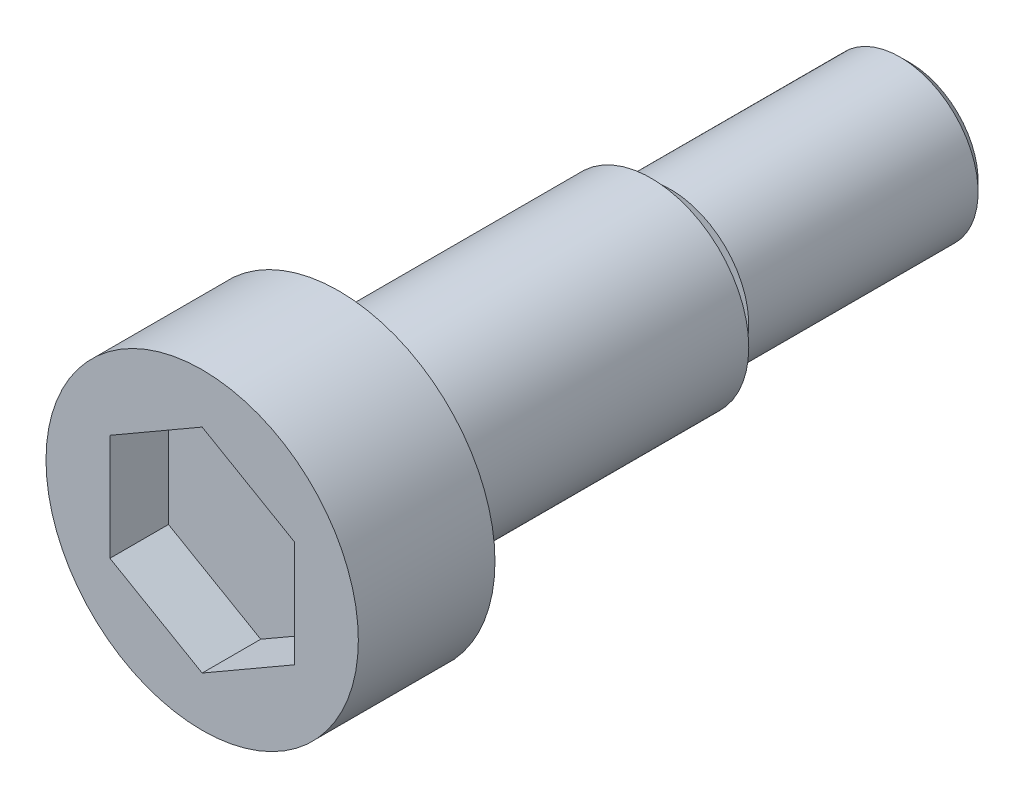
ISO-10303-21;
HEADER;
FILE_DESCRIPTION(('STEP AP214'),'2;1');
FILE_NAME('part.step','',(''),(''),'','','');
FILE_SCHEMA(('AUTOMOTIVE_DESIGN { 1 0 10303 214 1 1 1 1 }'));
ENDSEC;
DATA;
#1=APPLICATION_CONTEXT('core data for automotive mechanical design processes');
#2=APPLICATION_PROTOCOL_DEFINITION('international standard','automotive_design',2000,#1);
#3=PRODUCT_CONTEXT('',#1,'mechanical');
#4=PRODUCT('Part','Part','',(#3));
#5=PRODUCT_RELATED_PRODUCT_CATEGORY('part','',(#4));
#6=PRODUCT_DEFINITION_FORMATION('','',#4);
#7=PRODUCT_DEFINITION_CONTEXT('part definition',#1,'design');
#8=PRODUCT_DEFINITION('design','',#6,#7);
#9=PRODUCT_DEFINITION_SHAPE('','',#8);
#10=(LENGTH_UNIT() NAMED_UNIT(*) SI_UNIT(.MILLI.,.METRE.));
#11=(NAMED_UNIT(*) PLANE_ANGLE_UNIT() SI_UNIT($,.RADIAN.));
#12=(NAMED_UNIT(*) SI_UNIT($,.STERADIAN.) SOLID_ANGLE_UNIT());
#13=UNCERTAINTY_MEASURE_WITH_UNIT(LENGTH_MEASURE(1.E-05),#10,'distance_accuracy_value','');
#14=(GEOMETRIC_REPRESENTATION_CONTEXT(3) GLOBAL_UNCERTAINTY_ASSIGNED_CONTEXT((#13)) GLOBAL_UNIT_ASSIGNED_CONTEXT((#10,
#11,#12)) REPRESENTATION_CONTEXT('',''));
#15=CARTESIAN_POINT('',(0.,0.,0.));
#16=DIRECTION('',(0.,0.,1.));
#17=DIRECTION('',(1.,0.,0.));
#18=AXIS2_PLACEMENT_3D('',#15,#16,#17);
#19=CARTESIAN_POINT('',(0.,0.,16.));
#20=DIRECTION('',(0.,0.,-1.));
#21=DIRECTION('',(-1.,0.,0.));
#22=AXIS2_PLACEMENT_3D('',#19,#20,#21);
#23=CYLINDRICAL_SURFACE('',#22,5.);
#24=CARTESIAN_POINT('',(0.,0.,16.));
#25=DIRECTION('',(0.,0.,1.));
#26=DIRECTION('',(1.,0.,0.));
#27=AXIS2_PLACEMENT_3D('',#24,#25,#26);
#28=CIRCLE('',#27,5.);
#29=CARTESIAN_POINT('',(5.,0.,16.));
#30=VERTEX_POINT('',#29);
#31=EDGE_CURVE('E178',#30,#30,#28,.T.);
#32=ORIENTED_EDGE('',*,*,#31,.F.);
#33=EDGE_LOOP('',(#32));
#34=FACE_BOUND('',#33,.T.);
#35=CARTESIAN_POINT('',(0.,0.,0.));
#36=DIRECTION('',(0.,0.,1.));
#37=DIRECTION('',(1.,0.,0.));
#38=AXIS2_PLACEMENT_3D('',#35,#36,#37);
#39=CIRCLE('',#38,5.);
#40=CARTESIAN_POINT('',(5.,0.,0.));
#41=VERTEX_POINT('',#40);
#42=EDGE_CURVE('E174',#41,#41,#39,.T.);
#43=ORIENTED_EDGE('',*,*,#42,.T.);
#44=EDGE_LOOP('',(#43));
#45=FACE_BOUND('',#44,.T.);
#46=ADVANCED_FACE('F44',(#34,#45),#23,.T.);
#47=CARTESIAN_POINT('',(0.,0.,0.));
#48=DIRECTION('',(0.,0.,1.));
#49=DIRECTION('',(1.,0.,0.));
#50=AXIS2_PLACEMENT_3D('',#47,#48,#49);
#51=PLANE('',#50);
#52=ORIENTED_EDGE('',*,*,#42,.F.);
#53=EDGE_LOOP('',(#52));
#54=FACE_BOUND('',#53,.T.);
#55=CARTESIAN_POINT('',(0.,0.,0.));
#56=DIRECTION('',(0.,0.,-1.));
#57=DIRECTION('',(-1.,0.,0.));
#58=AXIS2_PLACEMENT_3D('',#55,#56,#57);
#59=CIRCLE('',#58,3.5);
#60=CARTESIAN_POINT('',(-3.5,0.,0.));
#61=VERTEX_POINT('',#60);
#62=EDGE_CURVE('E259',#61,#61,#59,.T.);
#63=ORIENTED_EDGE('',*,*,#62,.F.);
#64=EDGE_LOOP('',(#63));
#65=FACE_BOUND('',#64,.T.);
#66=ADVANCED_FACE('F203',(#54,#65),#51,.F.);
#67=CARTESIAN_POINT('',(0.,0.,23.));
#68=DIRECTION('',(0.,0.,-1.));
#69=DIRECTION('',(-1.,0.,0.));
#70=AXIS2_PLACEMENT_3D('',#67,#68,#69);
#71=CYLINDRICAL_SURFACE('',#70,8.);
#72=CARTESIAN_POINT('',(0.,0.,23.));
#73=DIRECTION('',(0.,0.,1.));
#74=DIRECTION('',(1.,0.,0.));
#75=AXIS2_PLACEMENT_3D('',#72,#73,#74);
#76=CIRCLE('',#75,8.);
#77=CARTESIAN_POINT('',(8.,0.,23.));
#78=VERTEX_POINT('',#77);
#79=EDGE_CURVE('E170',#78,#78,#76,.T.);
#80=ORIENTED_EDGE('',*,*,#79,.F.);
#81=EDGE_LOOP('',(#80));
#82=FACE_BOUND('',#81,.T.);
#83=CARTESIAN_POINT('',(0.,0.,16.));
#84=DIRECTION('',(0.,0.,1.));
#85=DIRECTION('',(1.,0.,0.));
#86=AXIS2_PLACEMENT_3D('',#83,#84,#85);
#87=CIRCLE('',#86,8.);
#88=CARTESIAN_POINT('',(8.,0.,16.));
#89=VERTEX_POINT('',#88);
#90=EDGE_CURVE('E160',#89,#89,#87,.T.);
#91=ORIENTED_EDGE('',*,*,#90,.T.);
#92=EDGE_LOOP('',(#91));
#93=FACE_BOUND('',#92,.T.);
#94=ADVANCED_FACE('F208',(#82,#93),#71,.T.);
#95=CARTESIAN_POINT('',(0.,0.,23.));
#96=DIRECTION('',(0.,0.,1.));
#97=DIRECTION('',(1.,0.,0.));
#98=AXIS2_PLACEMENT_3D('',#95,#96,#97);
#99=PLANE('',#98);
#100=DIRECTION('',(-0.866025403784442,0.499999999999995,0.));
#101=VECTOR('',#100,1.);
#102=CARTESIAN_POINT('',(4.72523829047929,2.72811759899342,23.));
#103=LINE('',#102,#101);
#104=CARTESIAN_POINT('',(4.72523829047929,2.72811759899342,23.));
#105=VERTEX_POINT('',#104);
#106=CARTESIAN_POINT('',(0.,5.45623519798673,23.));
#107=VERTEX_POINT('',#106);
#108=EDGE_CURVE('E60',#105,#107,#103,.T.);
#109=ORIENTED_EDGE('',*,*,#108,.F.);
#110=DIRECTION('',(0.,1.,0.));
#111=VECTOR('',#110,1.);
#112=CARTESIAN_POINT('',(4.72523829047935,-2.72811759899332,23.));
#113=LINE('',#112,#111);
#114=CARTESIAN_POINT('',(4.72523829047935,-2.72811759899332,23.));
#115=VERTEX_POINT('',#114);
#116=EDGE_CURVE('E154',#115,#105,#113,.T.);
#117=ORIENTED_EDGE('',*,*,#116,.F.);
#118=DIRECTION('',(0.866025403784435,0.500000000000007,0.));
#119=VECTOR('',#118,1.);
#120=CARTESIAN_POINT('',(0.,-5.45623519798673,23.));
#121=LINE('',#120,#119);
#122=CARTESIAN_POINT('',(0.,-5.45623519798673,23.));
#123=VERTEX_POINT('',#122);
#124=EDGE_CURVE('E151',#123,#115,#121,.T.);
#125=ORIENTED_EDGE('',*,*,#124,.F.);
#126=DIRECTION('',(0.866025403784442,-0.499999999999995,0.));
#127=VECTOR('',#126,1.);
#128=CARTESIAN_POINT('',(-4.72523829047931,-2.72811759899339,23.));
#129=LINE('',#128,#127);
#130=CARTESIAN_POINT('',(-4.72523829047931,-2.72811759899339,23.));
#131=VERTEX_POINT('',#130);
#132=EDGE_CURVE('E108',#131,#123,#129,.T.);
#133=ORIENTED_EDGE('',*,*,#132,.F.);
#134=DIRECTION('',(0.,-1.,0.));
#135=VECTOR('',#134,1.);
#136=CARTESIAN_POINT('',(-4.72523829047933,2.72811759899335,23.));
#137=LINE('',#136,#135);
#138=CARTESIAN_POINT('',(-4.72523829047933,2.72811759899335,23.));
#139=VERTEX_POINT('',#138);
#140=EDGE_CURVE('E146',#139,#131,#137,.T.);
#141=ORIENTED_EDGE('',*,*,#140,.F.);
#142=DIRECTION('',(-0.866025403784438,-0.500000000000001,0.));
#143=VECTOR('',#142,1.);
#144=CARTESIAN_POINT('',(0.,5.45623519798673,23.));
#145=LINE('',#144,#143);
#146=EDGE_CURVE('E142',#107,#139,#145,.T.);
#147=ORIENTED_EDGE('',*,*,#146,.F.);
#148=EDGE_LOOP('',(#109,#117,#125,#133,#141,#147));
#149=FACE_BOUND('',#148,.T.);
#150=ORIENTED_EDGE('',*,*,#79,.T.);
#151=EDGE_LOOP('',(#150));
#152=FACE_BOUND('',#151,.T.);
#153=ADVANCED_FACE('F216',(#149,#152),#99,.T.);
#154=CARTESIAN_POINT('',(0.,0.,16.));
#155=DIRECTION('',(0.,0.,1.));
#156=DIRECTION('',(1.,0.,0.));
#157=AXIS2_PLACEMENT_3D('',#154,#155,#156);
#158=PLANE('',#157);
#159=ORIENTED_EDGE('',*,*,#31,.T.);
#160=EDGE_LOOP('',(#159));
#161=FACE_BOUND('',#160,.T.);
#162=ORIENTED_EDGE('',*,*,#90,.F.);
#163=EDGE_LOOP('',(#162));
#164=FACE_BOUND('',#163,.T.);
#165=ADVANCED_FACE('F218',(#161,#164),#158,.F.);
#166=CARTESIAN_POINT('',(4.72523829047929,2.72811759899342,20.));
#167=DIRECTION('',(0.499999999999995,0.866025403784441,0.));
#168=DIRECTION('',(-0.866025403784442,0.499999999999995,0.));
#169=AXIS2_PLACEMENT_3D('',#166,#167,#168);
#170=PLANE('',#169);
#171=ORIENTED_EDGE('',*,*,#108,.T.);
#172=DIRECTION('',(0.,0.,1.));
#173=VECTOR('',#172,1.);
#174=CARTESIAN_POINT('',(0.,5.45623519798673,20.));
#175=LINE('',#174,#173);
#176=CARTESIAN_POINT('',(0.,5.45623519798673,20.));
#177=VERTEX_POINT('',#176);
#178=EDGE_CURVE('E90',#177,#107,#175,.T.);
#179=ORIENTED_EDGE('',*,*,#178,.F.);
#180=DIRECTION('',(-0.866025403784442,0.499999999999995,0.));
#181=VECTOR('',#180,1.);
#182=CARTESIAN_POINT('',(4.72523829047929,2.72811759899342,20.));
#183=LINE('',#182,#181);
#184=CARTESIAN_POINT('',(4.72523829047929,2.72811759899342,20.));
#185=VERTEX_POINT('',#184);
#186=EDGE_CURVE('E157',#185,#177,#183,.T.);
#187=ORIENTED_EDGE('',*,*,#186,.F.);
#188=DIRECTION('',(0.,0.,1.));
#189=VECTOR('',#188,1.);
#190=CARTESIAN_POINT('',(4.72523829047929,2.72811759899342,20.));
#191=LINE('',#190,#189);
#192=EDGE_CURVE('E68',#185,#105,#191,.T.);
#193=ORIENTED_EDGE('',*,*,#192,.T.);
#194=EDGE_LOOP('',(#171,#179,#187,#193));
#195=FACE_BOUND('',#194,.T.);
#196=ADVANCED_FACE('F221',(#195),#170,.F.);
#197=CARTESIAN_POINT('',(4.72523829047935,-2.72811759899332,20.));
#198=DIRECTION('',(1.,0.,0.));
#199=DIRECTION('',(0.,1.,0.));
#200=AXIS2_PLACEMENT_3D('',#197,#198,#199);
#201=PLANE('',#200);
#202=ORIENTED_EDGE('',*,*,#116,.T.);
#203=ORIENTED_EDGE('',*,*,#192,.F.);
#204=DIRECTION('',(0.,1.,0.));
#205=VECTOR('',#204,1.);
#206=CARTESIAN_POINT('',(4.72523829047935,-2.72811759899332,20.));
#207=LINE('',#206,#205);
#208=CARTESIAN_POINT('',(4.72523829047935,-2.72811759899332,20.));
#209=VERTEX_POINT('',#208);
#210=EDGE_CURVE('E122',#209,#185,#207,.T.);
#211=ORIENTED_EDGE('',*,*,#210,.F.);
#212=DIRECTION('',(0.,0.,1.));
#213=VECTOR('',#212,1.);
#214=CARTESIAN_POINT('',(4.72523829047935,-2.72811759899332,20.));
#215=LINE('',#214,#213);
#216=EDGE_CURVE('E113',#209,#115,#215,.T.);
#217=ORIENTED_EDGE('',*,*,#216,.T.);
#218=EDGE_LOOP('',(#202,#203,#211,#217));
#219=FACE_BOUND('',#218,.T.);
#220=ADVANCED_FACE('F228',(#219),#201,.F.);
#221=CARTESIAN_POINT('',(0.,-5.45623519798673,20.));
#222=DIRECTION('',(0.500000000000007,-0.866025403784434,0.));
#223=DIRECTION('',(0.866025403784435,0.500000000000007,0.));
#224=AXIS2_PLACEMENT_3D('',#221,#222,#223);
#225=PLANE('',#224);
#226=ORIENTED_EDGE('',*,*,#124,.T.);
#227=ORIENTED_EDGE('',*,*,#216,.F.);
#228=DIRECTION('',(0.866025403784435,0.500000000000007,0.));
#229=VECTOR('',#228,1.);
#230=CARTESIAN_POINT('',(0.,-5.45623519798673,20.));
#231=LINE('',#230,#229);
#232=CARTESIAN_POINT('',(0.,-5.45623519798673,20.));
#233=VERTEX_POINT('',#232);
#234=EDGE_CURVE('E117',#233,#209,#231,.T.);
#235=ORIENTED_EDGE('',*,*,#234,.F.);
#236=DIRECTION('',(0.,0.,1.));
#237=VECTOR('',#236,1.);
#238=CARTESIAN_POINT('',(0.,-5.45623519798673,20.));
#239=LINE('',#238,#237);
#240=EDGE_CURVE('E101',#233,#123,#239,.T.);
#241=ORIENTED_EDGE('',*,*,#240,.T.);
#242=EDGE_LOOP('',(#226,#227,#235,#241));
#243=FACE_BOUND('',#242,.T.);
#244=ADVANCED_FACE('F118',(#243),#225,.F.);
#245=CARTESIAN_POINT('',(-4.72523829047931,-2.72811759899339,20.));
#246=DIRECTION('',(-0.499999999999995,-0.866025403784441,0.));
#247=DIRECTION('',(0.866025403784442,-0.499999999999995,0.));
#248=AXIS2_PLACEMENT_3D('',#245,#246,#247);
#249=PLANE('',#248);
#250=ORIENTED_EDGE('',*,*,#132,.T.);
#251=ORIENTED_EDGE('',*,*,#240,.F.);
#252=DIRECTION('',(0.866025403784442,-0.499999999999995,0.));
#253=VECTOR('',#252,1.);
#254=CARTESIAN_POINT('',(-4.72523829047931,-2.72811759899339,20.));
#255=LINE('',#254,#253);
#256=CARTESIAN_POINT('',(-4.72523829047931,-2.72811759899339,20.));
#257=VERTEX_POINT('',#256);
#258=EDGE_CURVE('E105',#257,#233,#255,.T.);
#259=ORIENTED_EDGE('',*,*,#258,.F.);
#260=DIRECTION('',(0.,0.,1.));
#261=VECTOR('',#260,1.);
#262=CARTESIAN_POINT('',(-4.72523829047931,-2.72811759899339,20.));
#263=LINE('',#262,#261);
#264=EDGE_CURVE('E114',#257,#131,#263,.T.);
#265=ORIENTED_EDGE('',*,*,#264,.T.);
#266=EDGE_LOOP('',(#250,#251,#259,#265));
#267=FACE_BOUND('',#266,.T.);
#268=ADVANCED_FACE('F103',(#267),#249,.F.);
#269=CARTESIAN_POINT('',(-4.72523829047933,2.72811759899335,20.));
#270=DIRECTION('',(-1.,0.,0.));
#271=DIRECTION('',(0.,-1.,0.));
#272=AXIS2_PLACEMENT_3D('',#269,#270,#271);
#273=PLANE('',#272);
#274=ORIENTED_EDGE('',*,*,#140,.T.);
#275=ORIENTED_EDGE('',*,*,#264,.F.);
#276=DIRECTION('',(0.,-1.,0.));
#277=VECTOR('',#276,1.);
#278=CARTESIAN_POINT('',(-4.72523829047933,2.72811759899335,20.));
#279=LINE('',#278,#277);
#280=CARTESIAN_POINT('',(-4.72523829047933,2.72811759899335,20.));
#281=VERTEX_POINT('',#280);
#282=EDGE_CURVE('E128',#281,#257,#279,.T.);
#283=ORIENTED_EDGE('',*,*,#282,.F.);
#284=DIRECTION('',(0.,0.,1.));
#285=VECTOR('',#284,1.);
#286=CARTESIAN_POINT('',(-4.72523829047933,2.72811759899335,20.));
#287=LINE('',#286,#285);
#288=EDGE_CURVE('E165',#281,#139,#287,.T.);
#289=ORIENTED_EDGE('',*,*,#288,.T.);
#290=EDGE_LOOP('',(#274,#275,#283,#289));
#291=FACE_BOUND('',#290,.T.);
#292=ADVANCED_FACE('F232',(#291),#273,.F.);
#293=CARTESIAN_POINT('',(0.,5.45623519798673,20.));
#294=DIRECTION('',(-0.500000000000001,0.866025403784438,0.));
#295=DIRECTION('',(-0.866025403784438,-0.500000000000001,0.));
#296=AXIS2_PLACEMENT_3D('',#293,#294,#295);
#297=PLANE('',#296);
#298=ORIENTED_EDGE('',*,*,#146,.T.);
#299=ORIENTED_EDGE('',*,*,#288,.F.);
#300=DIRECTION('',(-0.866025403784438,-0.500000000000001,0.));
#301=VECTOR('',#300,1.);
#302=CARTESIAN_POINT('',(0.,5.45623519798673,20.));
#303=LINE('',#302,#301);
#304=EDGE_CURVE('E134',#177,#281,#303,.T.);
#305=ORIENTED_EDGE('',*,*,#304,.F.);
#306=ORIENTED_EDGE('',*,*,#178,.T.);
#307=EDGE_LOOP('',(#298,#299,#305,#306));
#308=FACE_BOUND('',#307,.T.);
#309=ADVANCED_FACE('F229',(#308),#297,.F.);
#310=CARTESIAN_POINT('',(0.,0.,20.));
#311=DIRECTION('',(0.,0.,1.));
#312=DIRECTION('',(1.,0.,0.));
#313=AXIS2_PLACEMENT_3D('',#310,#311,#312);
#314=PLANE('',#313);
#315=ORIENTED_EDGE('',*,*,#186,.T.);
#316=ORIENTED_EDGE('',*,*,#304,.T.);
#317=ORIENTED_EDGE('',*,*,#282,.T.);
#318=ORIENTED_EDGE('',*,*,#258,.T.);
#319=ORIENTED_EDGE('',*,*,#234,.T.);
#320=ORIENTED_EDGE('',*,*,#210,.T.);
#321=EDGE_LOOP('',(#315,#316,#317,#318,#319,#320));
#322=FACE_BOUND('',#321,.T.);
#323=ADVANCED_FACE('F125',(#322),#314,.T.);
#324=CARTESIAN_POINT('',(0.,0.,-1.));
#325=DIRECTION('',(0.,0.,-1.));
#326=DIRECTION('',(-1.,0.,0.));
#327=AXIS2_PLACEMENT_3D('',#324,#325,#326);
#328=PLANE('',#327);
#329=CARTESIAN_POINT('',(0.,0.,-1.));
#330=DIRECTION('',(0.,0.,-1.));
#331=DIRECTION('',(-1.,0.,0.));
#332=AXIS2_PLACEMENT_3D('',#329,#330,#331);
#333=CIRCLE('',#332,4.);
#334=CARTESIAN_POINT('',(-4.,0.,-1.));
#335=VERTEX_POINT('',#334);
#336=EDGE_CURVE('E143',#335,#335,#333,.T.);
#337=ORIENTED_EDGE('',*,*,#336,.F.);
#338=EDGE_LOOP('',(#337));
#339=FACE_BOUND('',#338,.T.);
#340=CARTESIAN_POINT('',(0.,0.,-1.));
#341=DIRECTION('',(0.,0.,-1.));
#342=DIRECTION('',(-1.,0.,0.));
#343=AXIS2_PLACEMENT_3D('',#340,#341,#342);
#344=CIRCLE('',#343,3.5);
#345=CARTESIAN_POINT('',(-3.5,0.,-1.));
#346=VERTEX_POINT('',#345);
#347=EDGE_CURVE('E256',#346,#346,#344,.T.);
#348=ORIENTED_EDGE('',*,*,#347,.T.);
#349=EDGE_LOOP('',(#348));
#350=FACE_BOUND('',#349,.T.);
#351=ADVANCED_FACE('F245',(#339,#350),#328,.F.);
#352=CARTESIAN_POINT('',(0.,0.,-1.));
#353=DIRECTION('',(0.,0.,1.));
#354=DIRECTION('',(1.,0.,0.));
#355=AXIS2_PLACEMENT_3D('',#352,#353,#354);
#356=CYLINDRICAL_SURFACE('',#355,3.5);
#357=ORIENTED_EDGE('',*,*,#347,.F.);
#358=EDGE_LOOP('',(#357));
#359=FACE_BOUND('',#358,.T.);
#360=ORIENTED_EDGE('',*,*,#62,.T.);
#361=EDGE_LOOP('',(#360));
#362=FACE_BOUND('',#361,.T.);
#363=ADVANCED_FACE('F199',(#359,#362),#356,.T.);
#364=CARTESIAN_POINT('',(0.,0.,-13.25));
#365=DIRECTION('',(0.,0.,-1.));
#366=DIRECTION('',(-1.,0.,0.));
#367=AXIS2_PLACEMENT_3D('',#364,#365,#366);
#368=PLANE('',#367);
#369=CARTESIAN_POINT('',(0.,0.,-13.25));
#370=DIRECTION('',(0.,0.,-1.));
#371=DIRECTION('',(-1.,0.,0.));
#372=AXIS2_PLACEMENT_3D('',#369,#370,#371);
#373=CIRCLE('',#372,3.5);
#374=CARTESIAN_POINT('',(-3.5,0.,-13.25));
#375=VERTEX_POINT('',#374);
#376=EDGE_CURVE('E53',#375,#375,#373,.T.);
#377=ORIENTED_EDGE('',*,*,#376,.T.);
#378=EDGE_LOOP('',(#377));
#379=FACE_BOUND('',#378,.T.);
#380=ADVANCED_FACE('F188',(#379),#368,.T.);
#381=CARTESIAN_POINT('',(0.,0.,-13.25));
#382=DIRECTION('',(0.,0.,1.));
#383=DIRECTION('',(1.,0.,0.));
#384=AXIS2_PLACEMENT_3D('',#381,#382,#383);
#385=CONICAL_SURFACE('',#384,3.5,0.785398163397445);
#386=CARTESIAN_POINT('',(0.,0.,-12.75));
#387=DIRECTION('',(0.,0.,-1.));
#388=DIRECTION('',(-1.,0.,0.));
#389=AXIS2_PLACEMENT_3D('',#386,#387,#388);
#390=CIRCLE('',#389,4.);
#391=CARTESIAN_POINT('',(-4.,0.,-12.75));
#392=VERTEX_POINT('',#391);
#393=EDGE_CURVE('E11',#392,#392,#390,.F.);
#394=ORIENTED_EDGE('',*,*,#393,.F.);
#395=EDGE_LOOP('',(#394));
#396=FACE_BOUND('',#395,.T.);
#397=ORIENTED_EDGE('',*,*,#376,.F.);
#398=EDGE_LOOP('',(#397));
#399=FACE_BOUND('',#398,.T.);
#400=ADVANCED_FACE('F46',(#396,#399),#385,.T.);
#401=CARTESIAN_POINT('',(0.,0.,-13.25));
#402=DIRECTION('',(0.,0.,1.));
#403=DIRECTION('',(1.,0.,0.));
#404=AXIS2_PLACEMENT_3D('',#401,#402,#403);
#405=CYLINDRICAL_SURFACE('',#404,4.);
#406=ORIENTED_EDGE('',*,*,#336,.T.);
#407=EDGE_LOOP('',(#406));
#408=FACE_BOUND('',#407,.T.);
#409=ORIENTED_EDGE('',*,*,#393,.T.);
#410=EDGE_LOOP('',(#409));
#411=FACE_BOUND('',#410,.T.);
#412=ADVANCED_FACE('F191',(#408,#411),#405,.T.);
#413=CLOSED_SHELL('',(#46,#66,#94,#153,#165,#196,#220,#244,#268,#292,#309,#323,#351,#363,#380,
#400,#412));
#414=MANIFOLD_SOLID_BREP('B2',#413);
#415=ADVANCED_BREP_SHAPE_REPRESENTATION('',(#18,#414),#14);
#416=SHAPE_DEFINITION_REPRESENTATION(#9,#415);
ENDSEC;
END-ISO-10303-21;
